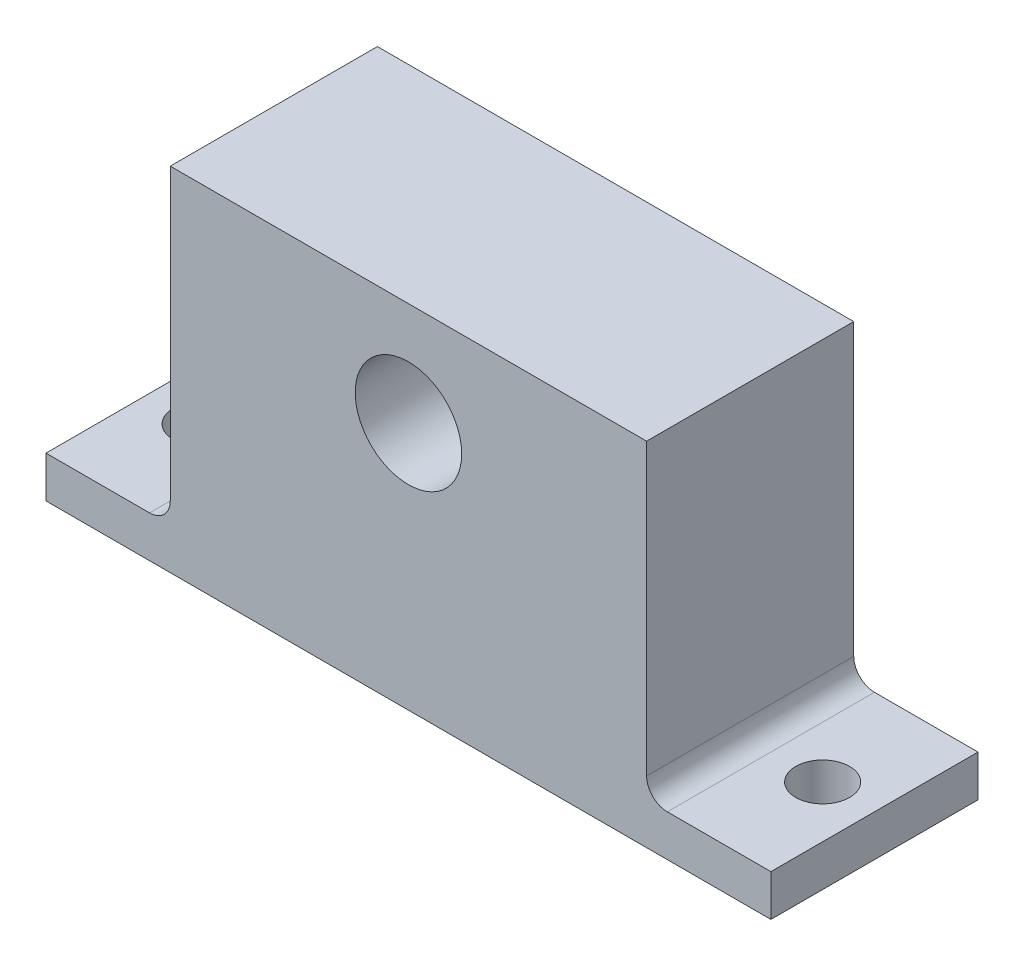
ISO-10303-21;
HEADER;
FILE_DESCRIPTION(('STEP AP214'),'2;1');
FILE_NAME('part.step','',(''),(''),'','','');
FILE_SCHEMA(('AUTOMOTIVE_DESIGN { 1 0 10303 214 1 1 1 1 }'));
ENDSEC;
DATA;
#1=APPLICATION_CONTEXT('core data for automotive mechanical design processes');
#2=APPLICATION_PROTOCOL_DEFINITION('international standard','automotive_design',2000,#1);
#3=PRODUCT_CONTEXT('',#1,'mechanical');
#4=PRODUCT('Part','Part','',(#3));
#5=PRODUCT_RELATED_PRODUCT_CATEGORY('part','',(#4));
#6=PRODUCT_DEFINITION_FORMATION('','',#4);
#7=PRODUCT_DEFINITION_CONTEXT('part definition',#1,'design');
#8=PRODUCT_DEFINITION('design','',#6,#7);
#9=PRODUCT_DEFINITION_SHAPE('','',#8);
#10=(LENGTH_UNIT() NAMED_UNIT(*) SI_UNIT(.MILLI.,.METRE.));
#11=(NAMED_UNIT(*) PLANE_ANGLE_UNIT() SI_UNIT($,.RADIAN.));
#12=(NAMED_UNIT(*) SI_UNIT($,.STERADIAN.) SOLID_ANGLE_UNIT());
#13=UNCERTAINTY_MEASURE_WITH_UNIT(LENGTH_MEASURE(1.E-05),#10,'distance_accuracy_value','');
#14=(GEOMETRIC_REPRESENTATION_CONTEXT(3) GLOBAL_UNCERTAINTY_ASSIGNED_CONTEXT((#13)) GLOBAL_UNIT_ASSIGNED_CONTEXT((#10,
#11,#12)) REPRESENTATION_CONTEXT('',''));
#15=CARTESIAN_POINT('',(0.,0.,0.));
#16=DIRECTION('',(0.,0.,1.));
#17=DIRECTION('',(1.,0.,0.));
#18=AXIS2_PLACEMENT_3D('',#15,#16,#17);
#19=CARTESIAN_POINT('',(0.,4.445,12.7));
#20=DIRECTION('',(0.,0.,-1.));
#21=DIRECTION('',(-1.,0.,0.));
#22=AXIS2_PLACEMENT_3D('',#19,#20,#21);
#23=CYLINDRICAL_SURFACE('',#22,1.8034);
#24=CARTESIAN_POINT('',(0.,4.445,0.));
#25=DIRECTION('',(0.,0.,-1.));
#26=DIRECTION('',(-1.,0.,0.));
#27=AXIS2_PLACEMENT_3D('',#24,#25,#26);
#28=CIRCLE('',#27,1.8034);
#29=CARTESIAN_POINT('',(-1.8034,4.445,0.));
#30=VERTEX_POINT('',#29);
#31=EDGE_CURVE('E221',#30,#30,#28,.T.);
#32=ORIENTED_EDGE('',*,*,#31,.T.);
#33=EDGE_LOOP('',(#32));
#34=FACE_BOUND('',#33,.T.);
#35=CARTESIAN_POINT('',(0.,4.445,7.62));
#36=DIRECTION('',(0.,0.,1.));
#37=DIRECTION('',(1.,0.,0.));
#38=AXIS2_PLACEMENT_3D('',#35,#36,#37);
#39=CIRCLE('',#38,1.8034);
#40=CARTESIAN_POINT('',(1.8034,4.445,7.62));
#41=VERTEX_POINT('',#40);
#42=EDGE_CURVE('E38',#41,#41,#39,.F.);
#43=ORIENTED_EDGE('',*,*,#42,.F.);
#44=EDGE_LOOP('',(#43));
#45=FACE_BOUND('',#44,.T.);
#46=ADVANCED_FACE('F34',(#34,#45),#23,.F.);
#47=CARTESIAN_POINT('',(22.225,-10.795,12.7));
#48=DIRECTION('',(-1.,0.,0.));
#49=DIRECTION('',(0.,0.,1.));
#50=AXIS2_PLACEMENT_3D('',#47,#48,#49);
#51=PLANE('',#50);
#52=DIRECTION('',(0.,1.,0.));
#53=VECTOR('',#52,1.);
#54=CARTESIAN_POINT('',(22.225,-10.795,0.));
#55=LINE('',#54,#53);
#56=CARTESIAN_POINT('',(22.225,-10.795,0.));
#57=VERTEX_POINT('',#56);
#58=CARTESIAN_POINT('',(22.225,-8.255,0.));
#59=VERTEX_POINT('',#58);
#60=EDGE_CURVE('E142',#57,#59,#55,.T.);
#61=ORIENTED_EDGE('',*,*,#60,.T.);
#62=DIRECTION('',(0.,0.,1.));
#63=VECTOR('',#62,1.);
#64=CARTESIAN_POINT('',(22.225,-8.255,0.));
#65=LINE('',#64,#63);
#66=CARTESIAN_POINT('',(22.225,-8.255,12.7));
#67=VERTEX_POINT('',#66);
#68=EDGE_CURVE('E186',#59,#67,#65,.T.);
#69=ORIENTED_EDGE('',*,*,#68,.T.);
#70=DIRECTION('',(0.,1.,0.));
#71=VECTOR('',#70,1.);
#72=CARTESIAN_POINT('',(22.225,-10.795,12.7));
#73=LINE('',#72,#71);
#74=CARTESIAN_POINT('',(22.225,-10.795,12.7));
#75=VERTEX_POINT('',#74);
#76=EDGE_CURVE('E139',#75,#67,#73,.T.);
#77=ORIENTED_EDGE('',*,*,#76,.F.);
#78=DIRECTION('',(0.,0.,-1.));
#79=VECTOR('',#78,1.);
#80=CARTESIAN_POINT('',(22.225,-10.795,12.7));
#81=LINE('',#80,#79);
#82=EDGE_CURVE('E146',#75,#57,#81,.T.);
#83=ORIENTED_EDGE('',*,*,#82,.T.);
#84=EDGE_LOOP('',(#61,#69,#77,#83));
#85=FACE_BOUND('',#84,.T.);
#86=ADVANCED_FACE('F204',(#85),#51,.F.);
#87=CARTESIAN_POINT('',(-22.225,10.795,12.7));
#88=DIRECTION('',(0.,-1.,0.));
#89=DIRECTION('',(0.,0.,-1.));
#90=AXIS2_PLACEMENT_3D('',#87,#88,#89);
#91=PLANE('',#90);
#92=DIRECTION('',(-1.,0.,0.));
#93=VECTOR('',#92,1.);
#94=CARTESIAN_POINT('',(-22.225,10.795,0.));
#95=LINE('',#94,#93);
#96=CARTESIAN_POINT('',(14.605,10.795,0.));
#97=VERTEX_POINT('',#96);
#98=CARTESIAN_POINT('',(-14.605,10.795,0.));
#99=VERTEX_POINT('',#98);
#100=EDGE_CURVE('E137',#97,#99,#95,.T.);
#101=ORIENTED_EDGE('',*,*,#100,.T.);
#102=DIRECTION('',(0.,0.,1.));
#103=VECTOR('',#102,1.);
#104=CARTESIAN_POINT('',(-14.605,10.795,0.));
#105=LINE('',#104,#103);
#106=CARTESIAN_POINT('',(-14.605,10.795,12.7));
#107=VERTEX_POINT('',#106);
#108=EDGE_CURVE('E131',#99,#107,#105,.T.);
#109=ORIENTED_EDGE('',*,*,#108,.T.);
#110=DIRECTION('',(-1.,0.,0.));
#111=VECTOR('',#110,1.);
#112=CARTESIAN_POINT('',(-22.225,10.795,12.7));
#113=LINE('',#112,#111);
#114=CARTESIAN_POINT('',(14.605,10.795,12.7));
#115=VERTEX_POINT('',#114);
#116=EDGE_CURVE('E192',#115,#107,#113,.T.);
#117=ORIENTED_EDGE('',*,*,#116,.F.);
#118=DIRECTION('',(0.,0.,1.));
#119=VECTOR('',#118,1.);
#120=CARTESIAN_POINT('',(14.605,10.795,0.));
#121=LINE('',#120,#119);
#122=EDGE_CURVE('E189',#97,#115,#121,.T.);
#123=ORIENTED_EDGE('',*,*,#122,.F.);
#124=EDGE_LOOP('',(#101,#109,#117,#123));
#125=FACE_BOUND('',#124,.T.);
#126=ADVANCED_FACE('F244',(#125),#91,.F.);
#127=CARTESIAN_POINT('',(-22.225,-10.795,12.7));
#128=DIRECTION('',(1.,0.,0.));
#129=DIRECTION('',(0.,0.,-1.));
#130=AXIS2_PLACEMENT_3D('',#127,#128,#129);
#131=PLANE('',#130);
#132=DIRECTION('',(0.,-1.,0.));
#133=VECTOR('',#132,1.);
#134=CARTESIAN_POINT('',(-22.225,-10.795,12.7));
#135=LINE('',#134,#133);
#136=CARTESIAN_POINT('',(-22.225,-8.255,12.7));
#137=VERTEX_POINT('',#136);
#138=CARTESIAN_POINT('',(-22.225,-10.795,12.7));
#139=VERTEX_POINT('',#138);
#140=EDGE_CURVE('E130',#137,#139,#135,.T.);
#141=ORIENTED_EDGE('',*,*,#140,.F.);
#142=DIRECTION('',(0.,0.,1.));
#143=VECTOR('',#142,1.);
#144=CARTESIAN_POINT('',(-22.225,-8.255,0.));
#145=LINE('',#144,#143);
#146=CARTESIAN_POINT('',(-22.225,-8.255,0.));
#147=VERTEX_POINT('',#146);
#148=EDGE_CURVE('E114',#147,#137,#145,.T.);
#149=ORIENTED_EDGE('',*,*,#148,.F.);
#150=DIRECTION('',(0.,-1.,0.));
#151=VECTOR('',#150,1.);
#152=CARTESIAN_POINT('',(-22.225,-10.795,0.));
#153=LINE('',#152,#151);
#154=CARTESIAN_POINT('',(-22.225,-10.795,0.));
#155=VERTEX_POINT('',#154);
#156=EDGE_CURVE('E128',#147,#155,#153,.T.);
#157=ORIENTED_EDGE('',*,*,#156,.T.);
#158=DIRECTION('',(0.,0.,-1.));
#159=VECTOR('',#158,1.);
#160=CARTESIAN_POINT('',(-22.225,-10.795,12.7));
#161=LINE('',#160,#159);
#162=EDGE_CURVE('E149',#139,#155,#161,.T.);
#163=ORIENTED_EDGE('',*,*,#162,.F.);
#164=EDGE_LOOP('',(#141,#149,#157,#163));
#165=FACE_BOUND('',#164,.T.);
#166=ADVANCED_FACE('F126',(#165),#131,.F.);
#167=CARTESIAN_POINT('',(-22.225,-10.795,12.7));
#168=DIRECTION('',(0.,1.,0.));
#169=DIRECTION('',(0.,0.,1.));
#170=AXIS2_PLACEMENT_3D('',#167,#168,#169);
#171=PLANE('',#170);
#172=CARTESIAN_POINT('',(19.05,-10.795,6.35));
#173=DIRECTION('',(0.,1.,0.));
#174=DIRECTION('',(0.,0.,1.));
#175=AXIS2_PLACEMENT_3D('',#172,#173,#174);
#176=CIRCLE('',#175,1.651);
#177=CARTESIAN_POINT('',(19.05,-10.795,8.001));
#178=VERTEX_POINT('',#177);
#179=EDGE_CURVE('E182',#178,#178,#176,.T.);
#180=ORIENTED_EDGE('',*,*,#179,.T.);
#181=EDGE_LOOP('',(#180));
#182=FACE_BOUND('',#181,.T.);
#183=CARTESIAN_POINT('',(-19.05,-10.795,6.4262));
#184=DIRECTION('',(0.,1.,0.));
#185=DIRECTION('',(0.,0.,1.));
#186=AXIS2_PLACEMENT_3D('',#183,#184,#185);
#187=CIRCLE('',#186,1.651);
#188=CARTESIAN_POINT('',(-19.05,-10.795,8.0772));
#189=VERTEX_POINT('',#188);
#190=EDGE_CURVE('E214',#189,#189,#187,.T.);
#191=ORIENTED_EDGE('',*,*,#190,.T.);
#192=EDGE_LOOP('',(#191));
#193=FACE_BOUND('',#192,.T.);
#194=DIRECTION('',(1.,0.,0.));
#195=VECTOR('',#194,1.);
#196=CARTESIAN_POINT('',(-22.225,-10.795,0.));
#197=LINE('',#196,#195);
#198=EDGE_CURVE('E136',#155,#57,#197,.T.);
#199=ORIENTED_EDGE('',*,*,#198,.T.);
#200=ORIENTED_EDGE('',*,*,#82,.F.);
#201=DIRECTION('',(1.,0.,0.));
#202=VECTOR('',#201,1.);
#203=CARTESIAN_POINT('',(-22.225,-10.795,12.7));
#204=LINE('',#203,#202);
#205=EDGE_CURVE('E150',#139,#75,#204,.T.);
#206=ORIENTED_EDGE('',*,*,#205,.F.);
#207=ORIENTED_EDGE('',*,*,#162,.T.);
#208=EDGE_LOOP('',(#199,#200,#206,#207));
#209=FACE_BOUND('',#208,.T.);
#210=ADVANCED_FACE('F208',(#182,#193,#209),#171,.F.);
#211=CARTESIAN_POINT('',(0.,0.,12.7));
#212=DIRECTION('',(0.,0.,-1.));
#213=DIRECTION('',(-1.,0.,0.));
#214=AXIS2_PLACEMENT_3D('',#211,#212,#213);
#215=PLANE('',#214);
#216=CARTESIAN_POINT('',(0.,4.445,12.7));
#217=DIRECTION('',(0.,0.,1.));
#218=DIRECTION('',(1.,0.,0.));
#219=AXIS2_PLACEMENT_3D('',#216,#217,#218);
#220=CIRCLE('',#219,3.2639);
#221=CARTESIAN_POINT('',(3.2639,4.445,12.7));
#222=VERTEX_POINT('',#221);
#223=EDGE_CURVE('E226',#222,#222,#220,.T.);
#224=ORIENTED_EDGE('',*,*,#223,.F.);
#225=EDGE_LOOP('',(#224));
#226=FACE_BOUND('',#225,.T.);
#227=ORIENTED_EDGE('',*,*,#116,.T.);
#228=DIRECTION('',(0.,1.,0.));
#229=VECTOR('',#228,1.);
#230=CARTESIAN_POINT('',(-14.605,10.795,12.7));
#231=LINE('',#230,#229);
#232=CARTESIAN_POINT('',(-14.605,-6.985,12.7));
#233=VERTEX_POINT('',#232);
#234=EDGE_CURVE('E122',#233,#107,#231,.T.);
#235=ORIENTED_EDGE('',*,*,#234,.F.);
#236=CARTESIAN_POINT('',(-15.875,-6.985,12.7));
#237=DIRECTION('',(0.,0.,-1.));
#238=DIRECTION('',(-1.,0.,0.));
#239=AXIS2_PLACEMENT_3D('',#236,#237,#238);
#240=CIRCLE('',#239,1.27);
#241=CARTESIAN_POINT('',(-15.875,-8.255,12.7));
#242=VERTEX_POINT('',#241);
#243=EDGE_CURVE('E156',#233,#242,#240,.T.);
#244=ORIENTED_EDGE('',*,*,#243,.T.);
#245=DIRECTION('',(1.,0.,0.));
#246=VECTOR('',#245,1.);
#247=CARTESIAN_POINT('',(-22.225,-8.255,12.7));
#248=LINE('',#247,#246);
#249=EDGE_CURVE('E188',#137,#242,#248,.T.);
#250=ORIENTED_EDGE('',*,*,#249,.F.);
#251=ORIENTED_EDGE('',*,*,#140,.T.);
#252=ORIENTED_EDGE('',*,*,#205,.T.);
#253=ORIENTED_EDGE('',*,*,#76,.T.);
#254=DIRECTION('',(1.,0.,0.));
#255=VECTOR('',#254,1.);
#256=CARTESIAN_POINT('',(22.225,-8.255,12.7));
#257=LINE('',#256,#255);
#258=CARTESIAN_POINT('',(15.875,-8.255,12.7));
#259=VERTEX_POINT('',#258);
#260=EDGE_CURVE('E169',#259,#67,#257,.T.);
#261=ORIENTED_EDGE('',*,*,#260,.F.);
#262=CARTESIAN_POINT('',(15.875,-6.985,12.7));
#263=DIRECTION('',(0.,0.,-1.));
#264=DIRECTION('',(-1.,0.,0.));
#265=AXIS2_PLACEMENT_3D('',#262,#263,#264);
#266=CIRCLE('',#265,1.27);
#267=CARTESIAN_POINT('',(14.605,-6.985,12.7));
#268=VERTEX_POINT('',#267);
#269=EDGE_CURVE('E43',#259,#268,#266,.T.);
#270=ORIENTED_EDGE('',*,*,#269,.T.);
#271=DIRECTION('',(0.,-1.,0.));
#272=VECTOR('',#271,1.);
#273=CARTESIAN_POINT('',(14.605,10.795,12.7));
#274=LINE('',#273,#272);
#275=EDGE_CURVE('E179',#115,#268,#274,.T.);
#276=ORIENTED_EDGE('',*,*,#275,.F.);
#277=EDGE_LOOP('',(#227,#235,#244,#250,#251,#252,#253,#261,#270,#276));
#278=FACE_BOUND('',#277,.T.);
#279=ADVANCED_FACE('F176',(#226,#278),#215,.F.);
#280=CARTESIAN_POINT('',(0.,0.,0.));
#281=DIRECTION('',(0.,0.,-1.));
#282=DIRECTION('',(-1.,0.,0.));
#283=AXIS2_PLACEMENT_3D('',#280,#281,#282);
#284=PLANE('',#283);
#285=ORIENTED_EDGE('',*,*,#31,.F.);
#286=EDGE_LOOP('',(#285));
#287=FACE_BOUND('',#286,.T.);
#288=DIRECTION('',(1.,0.,0.));
#289=VECTOR('',#288,1.);
#290=CARTESIAN_POINT('',(-22.225,-8.255,0.));
#291=LINE('',#290,#289);
#292=CARTESIAN_POINT('',(-15.875,-8.255,0.));
#293=VERTEX_POINT('',#292);
#294=EDGE_CURVE('E110',#147,#293,#291,.T.);
#295=ORIENTED_EDGE('',*,*,#294,.T.);
#296=CARTESIAN_POINT('',(-15.875,-6.985,0.));
#297=DIRECTION('',(0.,0.,-1.));
#298=DIRECTION('',(-1.,0.,0.));
#299=AXIS2_PLACEMENT_3D('',#296,#297,#298);
#300=CIRCLE('',#299,1.27);
#301=CARTESIAN_POINT('',(-14.605,-6.985,0.));
#302=VERTEX_POINT('',#301);
#303=EDGE_CURVE('E158',#293,#302,#300,.F.);
#304=ORIENTED_EDGE('',*,*,#303,.T.);
#305=DIRECTION('',(0.,1.,0.));
#306=VECTOR('',#305,1.);
#307=CARTESIAN_POINT('',(-14.605,10.795,0.));
#308=LINE('',#307,#306);
#309=EDGE_CURVE('E121',#302,#99,#308,.T.);
#310=ORIENTED_EDGE('',*,*,#309,.T.);
#311=ORIENTED_EDGE('',*,*,#100,.F.);
#312=DIRECTION('',(0.,-1.,0.));
#313=VECTOR('',#312,1.);
#314=CARTESIAN_POINT('',(14.605,10.795,0.));
#315=LINE('',#314,#313);
#316=CARTESIAN_POINT('',(14.605,-6.985,0.));
#317=VERTEX_POINT('',#316);
#318=EDGE_CURVE('E178',#97,#317,#315,.T.);
#319=ORIENTED_EDGE('',*,*,#318,.T.);
#320=CARTESIAN_POINT('',(15.875,-6.985,0.));
#321=DIRECTION('',(0.,0.,-1.));
#322=DIRECTION('',(-1.,0.,0.));
#323=AXIS2_PLACEMENT_3D('',#320,#321,#322);
#324=CIRCLE('',#323,1.27);
#325=CARTESIAN_POINT('',(15.875,-8.255,0.));
#326=VERTEX_POINT('',#325);
#327=EDGE_CURVE('E11',#317,#326,#324,.F.);
#328=ORIENTED_EDGE('',*,*,#327,.T.);
#329=DIRECTION('',(1.,0.,0.));
#330=VECTOR('',#329,1.);
#331=CARTESIAN_POINT('',(22.225,-8.255,0.));
#332=LINE('',#331,#330);
#333=EDGE_CURVE('E171',#326,#59,#332,.T.);
#334=ORIENTED_EDGE('',*,*,#333,.T.);
#335=ORIENTED_EDGE('',*,*,#60,.F.);
#336=ORIENTED_EDGE('',*,*,#198,.F.);
#337=ORIENTED_EDGE('',*,*,#156,.F.);
#338=EDGE_LOOP('',(#295,#304,#310,#311,#319,#328,#334,#335,#336,#337));
#339=FACE_BOUND('',#338,.T.);
#340=ADVANCED_FACE('F134',(#287,#339),#284,.T.);
#341=CARTESIAN_POINT('',(22.225,-8.255,0.));
#342=DIRECTION('',(0.,-1.,0.));
#343=DIRECTION('',(0.,0.,-1.));
#344=AXIS2_PLACEMENT_3D('',#341,#342,#343);
#345=PLANE('',#344);
#346=CARTESIAN_POINT('',(19.05,-8.255,6.35));
#347=DIRECTION('',(0.,1.,0.));
#348=DIRECTION('',(-1.,0.,0.));
#349=AXIS2_PLACEMENT_3D('',#346,#347,#348);
#350=CIRCLE('',#349,1.651);
#351=CARTESIAN_POINT('',(17.399,-8.255,6.35));
#352=VERTEX_POINT('',#351);
#353=EDGE_CURVE('E217',#352,#352,#350,.T.);
#354=ORIENTED_EDGE('',*,*,#353,.F.);
#355=EDGE_LOOP('',(#354));
#356=FACE_BOUND('',#355,.T.);
#357=ORIENTED_EDGE('',*,*,#333,.F.);
#358=DIRECTION('',(0.,0.,1.));
#359=VECTOR('',#358,1.);
#360=CARTESIAN_POINT('',(15.875,-8.255,12.7));
#361=LINE('',#360,#359);
#362=EDGE_CURVE('E160',#326,#259,#361,.T.);
#363=ORIENTED_EDGE('',*,*,#362,.T.);
#364=ORIENTED_EDGE('',*,*,#260,.T.);
#365=ORIENTED_EDGE('',*,*,#68,.F.);
#366=EDGE_LOOP('',(#357,#363,#364,#365));
#367=FACE_BOUND('',#366,.T.);
#368=ADVANCED_FACE('F167',(#356,#367),#345,.F.);
#369=CARTESIAN_POINT('',(14.605,10.795,0.));
#370=DIRECTION('',(-1.,0.,0.));
#371=DIRECTION('',(0.,-1.,0.));
#372=AXIS2_PLACEMENT_3D('',#369,#370,#371);
#373=PLANE('',#372);
#374=ORIENTED_EDGE('',*,*,#275,.T.);
#375=DIRECTION('',(0.,0.,1.));
#376=VECTOR('',#375,1.);
#377=CARTESIAN_POINT('',(14.605,-6.985,0.));
#378=LINE('',#377,#376);
#379=EDGE_CURVE('E50',#268,#317,#378,.F.);
#380=ORIENTED_EDGE('',*,*,#379,.T.);
#381=ORIENTED_EDGE('',*,*,#318,.F.);
#382=ORIENTED_EDGE('',*,*,#122,.T.);
#383=EDGE_LOOP('',(#374,#380,#381,#382));
#384=FACE_BOUND('',#383,.T.);
#385=ADVANCED_FACE('F261',(#384),#373,.F.);
#386=CARTESIAN_POINT('',(-14.605,10.795,0.));
#387=DIRECTION('',(1.,0.,0.));
#388=DIRECTION('',(0.,1.,0.));
#389=AXIS2_PLACEMENT_3D('',#386,#387,#388);
#390=PLANE('',#389);
#391=ORIENTED_EDGE('',*,*,#309,.F.);
#392=DIRECTION('',(0.,0.,1.));
#393=VECTOR('',#392,1.);
#394=CARTESIAN_POINT('',(-14.605,-6.985,12.7));
#395=LINE('',#394,#393);
#396=EDGE_CURVE('E152',#302,#233,#395,.T.);
#397=ORIENTED_EDGE('',*,*,#396,.T.);
#398=ORIENTED_EDGE('',*,*,#234,.T.);
#399=ORIENTED_EDGE('',*,*,#108,.F.);
#400=EDGE_LOOP('',(#391,#397,#398,#399));
#401=FACE_BOUND('',#400,.T.);
#402=ADVANCED_FACE('F258',(#401),#390,.F.);
#403=CARTESIAN_POINT('',(-22.225,-8.255,0.));
#404=DIRECTION('',(0.,-1.,0.));
#405=DIRECTION('',(0.,0.,-1.));
#406=AXIS2_PLACEMENT_3D('',#403,#404,#405);
#407=PLANE('',#406);
#408=CARTESIAN_POINT('',(-19.05,-8.25499999999999,6.4262));
#409=DIRECTION('',(0.,1.,0.));
#410=DIRECTION('',(-1.,0.,0.));
#411=AXIS2_PLACEMENT_3D('',#408,#409,#410);
#412=CIRCLE('',#411,1.651);
#413=CARTESIAN_POINT('',(-20.701,-8.25499999999999,6.4262));
#414=VERTEX_POINT('',#413);
#415=EDGE_CURVE('E218',#414,#414,#412,.T.);
#416=ORIENTED_EDGE('',*,*,#415,.F.);
#417=EDGE_LOOP('',(#416));
#418=FACE_BOUND('',#417,.T.);
#419=ORIENTED_EDGE('',*,*,#249,.T.);
#420=DIRECTION('',(0.,0.,1.));
#421=VECTOR('',#420,1.);
#422=CARTESIAN_POINT('',(-15.875,-8.255,0.));
#423=LINE('',#422,#421);
#424=EDGE_CURVE('E117',#242,#293,#423,.F.);
#425=ORIENTED_EDGE('',*,*,#424,.T.);
#426=ORIENTED_EDGE('',*,*,#294,.F.);
#427=ORIENTED_EDGE('',*,*,#148,.T.);
#428=EDGE_LOOP('',(#419,#425,#426,#427));
#429=FACE_BOUND('',#428,.T.);
#430=ADVANCED_FACE('F113',(#418,#429),#407,.F.);
#431=CARTESIAN_POINT('',(-15.875,-6.985,0.));
#432=DIRECTION('',(0.,0.,-1.));
#433=DIRECTION('',(-1.,0.,0.));
#434=AXIS2_PLACEMENT_3D('',#431,#432,#433);
#435=CYLINDRICAL_SURFACE('',#434,1.27);
#436=ORIENTED_EDGE('',*,*,#303,.F.);
#437=ORIENTED_EDGE('',*,*,#424,.F.);
#438=ORIENTED_EDGE('',*,*,#243,.F.);
#439=ORIENTED_EDGE('',*,*,#396,.F.);
#440=EDGE_LOOP('',(#436,#437,#438,#439));
#441=FACE_BOUND('',#440,.T.);
#442=ADVANCED_FACE('F265',(#441),#435,.F.);
#443=CARTESIAN_POINT('',(15.875,-6.985,0.));
#444=DIRECTION('',(0.,0.,-1.));
#445=DIRECTION('',(-1.,0.,0.));
#446=AXIS2_PLACEMENT_3D('',#443,#444,#445);
#447=CYLINDRICAL_SURFACE('',#446,1.27);
#448=ORIENTED_EDGE('',*,*,#327,.F.);
#449=ORIENTED_EDGE('',*,*,#379,.F.);
#450=ORIENTED_EDGE('',*,*,#269,.F.);
#451=ORIENTED_EDGE('',*,*,#362,.F.);
#452=EDGE_LOOP('',(#448,#449,#450,#451));
#453=FACE_BOUND('',#452,.T.);
#454=ADVANCED_FACE('F36',(#453),#447,.F.);
#455=CARTESIAN_POINT('',(-19.05,-20.955,6.4262));
#456=DIRECTION('',(0.,1.,0.));
#457=DIRECTION('',(-1.,0.,0.));
#458=AXIS2_PLACEMENT_3D('',#455,#456,#457);
#459=CYLINDRICAL_SURFACE('',#458,1.651);
#460=ORIENTED_EDGE('',*,*,#415,.T.);
#461=EDGE_LOOP('',(#460));
#462=FACE_BOUND('',#461,.T.);
#463=ORIENTED_EDGE('',*,*,#190,.F.);
#464=EDGE_LOOP('',(#463));
#465=FACE_BOUND('',#464,.T.);
#466=ADVANCED_FACE('F253',(#462,#465),#459,.F.);
#467=CARTESIAN_POINT('',(19.05,-20.955,6.35));
#468=DIRECTION('',(0.,1.,0.));
#469=DIRECTION('',(-1.,0.,0.));
#470=AXIS2_PLACEMENT_3D('',#467,#468,#469);
#471=CYLINDRICAL_SURFACE('',#470,1.651);
#472=ORIENTED_EDGE('',*,*,#353,.T.);
#473=EDGE_LOOP('',(#472));
#474=FACE_BOUND('',#473,.T.);
#475=ORIENTED_EDGE('',*,*,#179,.F.);
#476=EDGE_LOOP('',(#475));
#477=FACE_BOUND('',#476,.T.);
#478=ADVANCED_FACE('F250',(#474,#477),#471,.F.);
#479=CARTESIAN_POINT('',(0.,4.445,7.62));
#480=DIRECTION('',(0.,0.,1.));
#481=DIRECTION('',(1.,0.,0.));
#482=AXIS2_PLACEMENT_3D('',#479,#480,#481);
#483=PLANE('',#482);
#484=CARTESIAN_POINT('',(0.,4.445,7.62));
#485=DIRECTION('',(0.,0.,1.));
#486=DIRECTION('',(1.,0.,0.));
#487=AXIS2_PLACEMENT_3D('',#484,#485,#486);
#488=CIRCLE('',#487,3.2639);
#489=CARTESIAN_POINT('',(3.2639,4.445,7.62));
#490=VERTEX_POINT('',#489);
#491=EDGE_CURVE('E229',#490,#490,#488,.T.);
#492=ORIENTED_EDGE('',*,*,#491,.T.);
#493=EDGE_LOOP('',(#492));
#494=FACE_BOUND('',#493,.T.);
#495=ORIENTED_EDGE('',*,*,#42,.T.);
#496=EDGE_LOOP('',(#495));
#497=FACE_BOUND('',#496,.T.);
#498=ADVANCED_FACE('F236',(#494,#497),#483,.T.);
#499=CARTESIAN_POINT('',(0.,4.445,7.62));
#500=DIRECTION('',(0.,0.,1.));
#501=DIRECTION('',(1.,0.,0.));
#502=AXIS2_PLACEMENT_3D('',#499,#500,#501);
#503=CYLINDRICAL_SURFACE('',#502,3.2639);
#504=ORIENTED_EDGE('',*,*,#491,.F.);
#505=EDGE_LOOP('',(#504));
#506=FACE_BOUND('',#505,.T.);
#507=ORIENTED_EDGE('',*,*,#223,.T.);
#508=EDGE_LOOP('',(#507));
#509=FACE_BOUND('',#508,.T.);
#510=ADVANCED_FACE('F248',(#506,#509),#503,.F.);
#511=CLOSED_SHELL('',(#46,#86,#126,#166,#210,#279,#340,#368,#385,#402,#430,#442,#454,#466,#478,
#498,#510));
#512=MANIFOLD_SOLID_BREP('B2',#511);
#513=ADVANCED_BREP_SHAPE_REPRESENTATION('',(#18,#512),#14);
#514=SHAPE_DEFINITION_REPRESENTATION(#9,#513);
ENDSEC;
END-ISO-10303-21;
